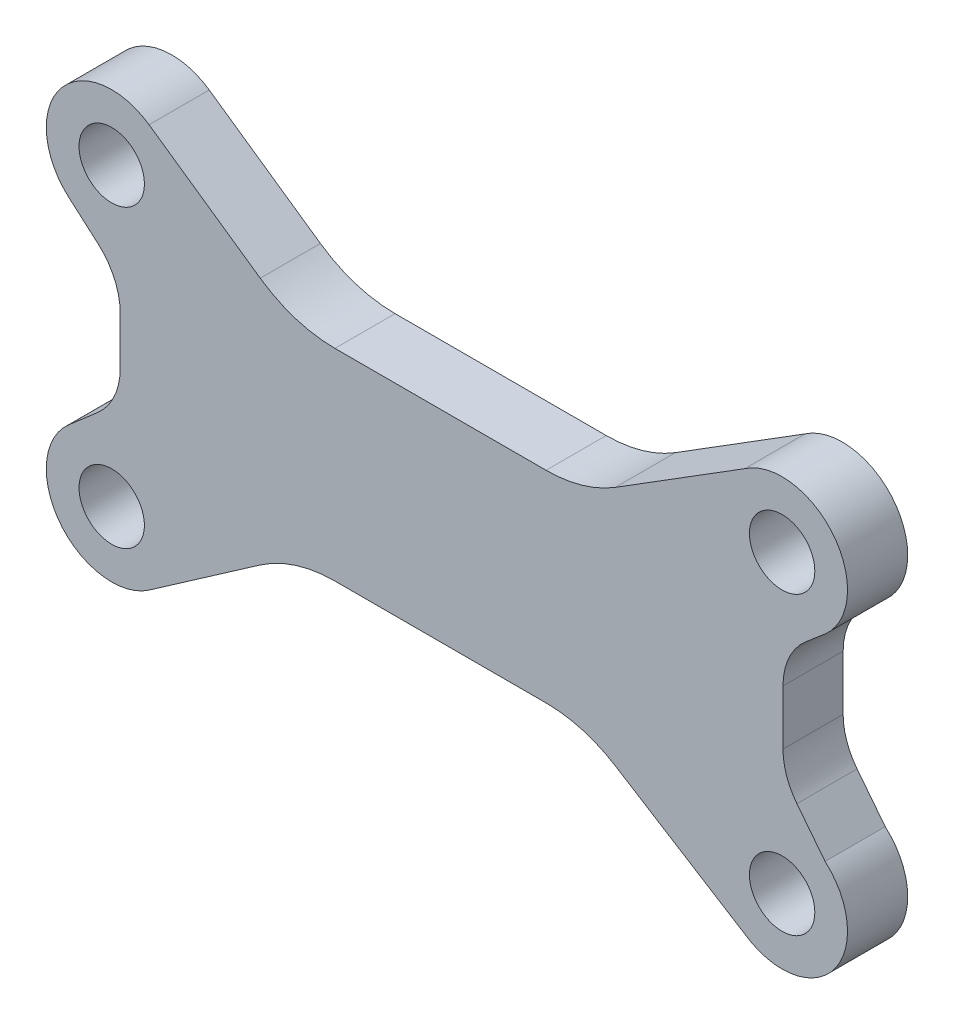
ISO-10303-21;
HEADER;
FILE_DESCRIPTION(('STEP AP214'),'2;1');
FILE_NAME('part.step','',(''),(''),'','','');
FILE_SCHEMA(('AUTOMOTIVE_DESIGN { 1 0 10303 214 1 1 1 1 }'));
ENDSEC;
DATA;
#1=APPLICATION_CONTEXT('core data for automotive mechanical design processes');
#2=APPLICATION_PROTOCOL_DEFINITION('international standard','automotive_design',2000,#1);
#3=PRODUCT_CONTEXT('',#1,'mechanical');
#4=PRODUCT('Part','Part','',(#3));
#5=PRODUCT_RELATED_PRODUCT_CATEGORY('part','',(#4));
#6=PRODUCT_DEFINITION_FORMATION('','',#4);
#7=PRODUCT_DEFINITION_CONTEXT('part definition',#1,'design');
#8=PRODUCT_DEFINITION('design','',#6,#7);
#9=PRODUCT_DEFINITION_SHAPE('','',#8);
#10=(LENGTH_UNIT() NAMED_UNIT(*) SI_UNIT(.MILLI.,.METRE.));
#11=(NAMED_UNIT(*) PLANE_ANGLE_UNIT() SI_UNIT($,.RADIAN.));
#12=(NAMED_UNIT(*) SI_UNIT($,.STERADIAN.) SOLID_ANGLE_UNIT());
#13=UNCERTAINTY_MEASURE_WITH_UNIT(LENGTH_MEASURE(1.E-05),#10,'distance_accuracy_value','');
#14=(GEOMETRIC_REPRESENTATION_CONTEXT(3) GLOBAL_UNCERTAINTY_ASSIGNED_CONTEXT((#13)) GLOBAL_UNIT_ASSIGNED_CONTEXT((#10,
#11,#12)) REPRESENTATION_CONTEXT('',''));
#15=CARTESIAN_POINT('',(0.,0.,0.));
#16=DIRECTION('',(0.,0.,1.));
#17=DIRECTION('',(1.,0.,0.));
#18=AXIS2_PLACEMENT_3D('',#15,#16,#17);
#19=CARTESIAN_POINT('',(7.9988438587581,12.7968153605601,5.842));
#20=DIRECTION('',(0.530038692512877,0.847973457390761,0.));
#21=DIRECTION('',(-0.847973457390761,0.530038692512877,0.));
#22=AXIS2_PLACEMENT_3D('',#19,#20,#21);
#23=PLANE('',#22);
#24=DIRECTION('',(0.847973457390761,-0.530038692512877,0.));
#25=VECTOR('',#24,1.);
#26=CARTESIAN_POINT('',(7.9988438587581,12.7968153605601,5.842));
#27=LINE('',#26,#25);
#28=CARTESIAN_POINT('',(30.0775501632188,-1.00381544927842,5.842));
#29=VERTEX_POINT('',#28);
#30=CARTESIAN_POINT('',(42.6381003070978,-8.85497814485335,5.842));
#31=VERTEX_POINT('',#30);
#32=EDGE_CURVE('E194',#29,#31,#27,.T.);
#33=ORIENTED_EDGE('',*,*,#32,.F.);
#34=DIRECTION('',(0.,0.,-1.));
#35=VECTOR('',#34,1.);
#36=CARTESIAN_POINT('',(30.0775501632188,-1.00381544927842,0.));
#37=LINE('',#36,#35);
#38=CARTESIAN_POINT('',(30.0775501632188,-1.00381544927842,0.));
#39=VERTEX_POINT('',#38);
#40=EDGE_CURVE('E262',#29,#39,#37,.T.);
#41=ORIENTED_EDGE('',*,*,#40,.T.);
#42=DIRECTION('',(0.847973457390761,-0.530038692512877,0.));
#43=VECTOR('',#42,1.);
#44=CARTESIAN_POINT('',(7.9988438587581,12.7968153605601,0.));
#45=LINE('',#44,#43);
#46=CARTESIAN_POINT('',(42.6381003070978,-8.85497814485335,0.));
#47=VERTEX_POINT('',#46);
#48=EDGE_CURVE('E219',#39,#47,#45,.T.);
#49=ORIENTED_EDGE('',*,*,#48,.T.);
#50=DIRECTION('',(0.,0.,-1.));
#51=VECTOR('',#50,1.);
#52=CARTESIAN_POINT('',(42.6381003070978,-8.85497814485335,5.842));
#53=LINE('',#52,#51);
#54=EDGE_CURVE('E213',#31,#47,#53,.T.);
#55=ORIENTED_EDGE('',*,*,#54,.F.);
#56=EDGE_LOOP('',(#33,#41,#49,#55));
#57=FACE_BOUND('',#56,.T.);
#58=ADVANCED_FACE('F35',(#57),#23,.F.);
#59=CARTESIAN_POINT('',(46.2642857142858,-3.64217857142864,5.842));
#60=DIRECTION('',(0.,0.,-1.));
#61=DIRECTION('',(-1.,0.,0.));
#62=AXIS2_PLACEMENT_3D('',#59,#60,#61);
#63=CYLINDRICAL_SURFACE('',#62,6.34999999999998);
#64=CARTESIAN_POINT('',(46.2642857142858,-3.64217857142864,0.));
#65=DIRECTION('',(0.,0.,1.));
#66=DIRECTION('',(1.,0.,0.));
#67=AXIS2_PLACEMENT_3D('',#64,#65,#66);
#68=CIRCLE('',#67,6.34999999999998);
#69=CARTESIAN_POINT('',(50.4355568317075,1.14561813112288,0.));
#70=VERTEX_POINT('',#69);
#71=EDGE_CURVE('E348',#47,#70,#68,.T.);
#72=ORIENTED_EDGE('',*,*,#71,.T.);
#73=DIRECTION('',(0.,0.,-1.));
#74=VECTOR('',#73,1.);
#75=CARTESIAN_POINT('',(50.4355568317075,1.14561813112288,5.842));
#76=LINE('',#75,#74);
#77=CARTESIAN_POINT('',(50.4355568317075,1.14561813112288,5.842));
#78=VERTEX_POINT('',#77);
#79=EDGE_CURVE('E215',#78,#70,#76,.T.);
#80=ORIENTED_EDGE('',*,*,#79,.F.);
#81=CARTESIAN_POINT('',(46.2642857142858,-3.64217857142864,5.842));
#82=DIRECTION('',(0.,0.,1.));
#83=DIRECTION('',(1.,0.,0.));
#84=AXIS2_PLACEMENT_3D('',#81,#82,#83);
#85=CIRCLE('',#84,6.34999999999998);
#86=EDGE_CURVE('E199',#31,#78,#85,.T.);
#87=ORIENTED_EDGE('',*,*,#86,.F.);
#88=ORIENTED_EDGE('',*,*,#54,.T.);
#89=EDGE_LOOP('',(#72,#80,#87,#88));
#90=FACE_BOUND('',#89,.T.);
#91=ADVANCED_FACE('F212',(#90),#63,.T.);
#92=CARTESIAN_POINT('',(31.8134522209213,24.9195038209863,5.842));
#93=DIRECTION('',(0.787240471629052,0.616646122041863,0.));
#94=DIRECTION('',(-0.616646122041863,0.787240471629052,0.));
#95=AXIS2_PLACEMENT_3D('',#92,#93,#94);
#96=PLANE('',#95);
#97=DIRECTION('',(0.616646122041863,-0.787240471629052,0.));
#98=VECTOR('',#97,1.);
#99=CARTESIAN_POINT('',(31.8134522209213,24.9195038209863,0.));
#100=LINE('',#99,#98);
#101=CARTESIAN_POINT('',(47.6995913394399,4.63848492701161,0.));
#102=VERTEX_POINT('',#101);
#103=EDGE_CURVE('E350',#102,#70,#100,.T.);
#104=ORIENTED_EDGE('',*,*,#103,.F.);
#105=DIRECTION('',(0.,0.,-1.));
#106=VECTOR('',#105,1.);
#107=CARTESIAN_POINT('',(47.6995913394399,4.63848492701161,5.842));
#108=LINE('',#107,#106);
#109=CARTESIAN_POINT('',(47.6995913394399,4.63848492701161,5.842));
#110=VERTEX_POINT('',#109);
#111=EDGE_CURVE('E244',#102,#110,#108,.F.);
#112=ORIENTED_EDGE('',*,*,#111,.T.);
#113=DIRECTION('',(0.616646122041863,-0.787240471629052,0.));
#114=VECTOR('',#113,1.);
#115=CARTESIAN_POINT('',(31.8134522209213,24.9195038209863,5.842));
#116=LINE('',#115,#114);
#117=EDGE_CURVE('E216',#110,#78,#116,.T.);
#118=ORIENTED_EDGE('',*,*,#117,.T.);
#119=ORIENTED_EDGE('',*,*,#79,.T.);
#120=EDGE_LOOP('',(#104,#112,#118,#119));
#121=FACE_BOUND('',#120,.T.);
#122=ADVANCED_FACE('F467',(#121),#96,.T.);
#123=CARTESIAN_POINT('',(46.3485683342843,0.,5.842));
#124=DIRECTION('',(1.,0.,0.));
#125=DIRECTION('',(0.,0.,-1.));
#126=AXIS2_PLACEMENT_3D('',#123,#124,#125);
#127=PLANE('',#126);
#128=DIRECTION('',(0.,-1.,0.));
#129=VECTOR('',#128,1.);
#130=CARTESIAN_POINT('',(46.3485683342843,0.,0.));
#131=LINE('',#130,#129);
#132=CARTESIAN_POINT('',(46.3485683342843,13.8618043816147,0.));
#133=VERTEX_POINT('',#132);
#134=CARTESIAN_POINT('',(46.3485683342843,8.55418780197744,0.));
#135=VERTEX_POINT('',#134);
#136=EDGE_CURVE('E352',#133,#135,#131,.T.);
#137=ORIENTED_EDGE('',*,*,#136,.F.);
#138=DIRECTION('',(0.,0.,-1.));
#139=VECTOR('',#138,1.);
#140=CARTESIAN_POINT('',(46.3485683342843,13.8618043816147,5.842));
#141=LINE('',#140,#139);
#142=CARTESIAN_POINT('',(46.3485683342843,13.8618043816147,5.842));
#143=VERTEX_POINT('',#142);
#144=EDGE_CURVE('E242',#133,#143,#141,.F.);
#145=ORIENTED_EDGE('',*,*,#144,.T.);
#146=DIRECTION('',(0.,-1.,0.));
#147=VECTOR('',#146,1.);
#148=CARTESIAN_POINT('',(46.3485683342843,0.,5.842));
#149=LINE('',#148,#147);
#150=CARTESIAN_POINT('',(46.3485683342843,8.55418780197744,5.842));
#151=VERTEX_POINT('',#150);
#152=EDGE_CURVE('E412',#143,#151,#149,.T.);
#153=ORIENTED_EDGE('',*,*,#152,.T.);
#154=DIRECTION('',(0.,0.,-1.));
#155=VECTOR('',#154,1.);
#156=CARTESIAN_POINT('',(46.3485683342843,8.55418780197744,0.));
#157=LINE('',#156,#155);
#158=EDGE_CURVE('E239',#151,#135,#157,.T.);
#159=ORIENTED_EDGE('',*,*,#158,.T.);
#160=EDGE_LOOP('',(#137,#145,#153,#159));
#161=FACE_BOUND('',#160,.T.);
#162=ADVANCED_FACE('F653',(#161),#127,.T.);
#163=CARTESIAN_POINT('',(11.1483390324467,-13.1175028613776,5.842));
#164=DIRECTION('',(-0.647596538075008,0.761983414434503,0.));
#165=DIRECTION('',(-0.761983414434503,-0.647596538075008,0.));
#166=AXIS2_PLACEMENT_3D('',#163,#164,#165);
#167=PLANE('',#166);
#168=DIRECTION('',(0.761983414434503,0.647596538075009,0.));
#169=VECTOR('',#168,1.);
#170=CARTESIAN_POINT('',(11.1483390324467,-13.1175028613776,5.842));
#171=LINE('',#170,#169);
#172=CARTESIAN_POINT('',(48.586330317508,18.7003990632738,5.842));
#173=VERTEX_POINT('',#172);
#174=CARTESIAN_POINT('',(50.4355568317075,20.2720247260198,5.842));
#175=VERTEX_POINT('',#174);
#176=EDGE_CURVE('E410',#173,#175,#171,.T.);
#177=ORIENTED_EDGE('',*,*,#176,.F.);
#178=DIRECTION('',(0.,0.,-1.));
#179=VECTOR('',#178,1.);
#180=CARTESIAN_POINT('',(48.586330317508,18.7003990632738,5.842));
#181=LINE('',#180,#179);
#182=CARTESIAN_POINT('',(48.586330317508,18.7003990632738,0.));
#183=VERTEX_POINT('',#182);
#184=EDGE_CURVE('E236',#173,#183,#181,.T.);
#185=ORIENTED_EDGE('',*,*,#184,.T.);
#186=DIRECTION('',(0.761983414434503,0.647596538075009,0.));
#187=VECTOR('',#186,1.);
#188=CARTESIAN_POINT('',(11.1483390324467,-13.1175028613776,0.));
#189=LINE('',#188,#187);
#190=CARTESIAN_POINT('',(50.4355568317075,20.2720247260198,0.));
#191=VERTEX_POINT('',#190);
#192=EDGE_CURVE('E355',#183,#191,#189,.T.);
#193=ORIENTED_EDGE('',*,*,#192,.T.);
#194=DIRECTION('',(0.,0.,-1.));
#195=VECTOR('',#194,1.);
#196=CARTESIAN_POINT('',(50.4355568317075,20.2720247260198,5.842));
#197=LINE('',#196,#195);
#198=EDGE_CURVE('E225',#175,#191,#197,.T.);
#199=ORIENTED_EDGE('',*,*,#198,.F.);
#200=EDGE_LOOP('',(#177,#185,#193,#199));
#201=FACE_BOUND('',#200,.T.);
#202=ADVANCED_FACE('F648',(#201),#167,.F.);
#203=CARTESIAN_POINT('',(46.2642857142858,25.0598214285714,5.842));
#204=DIRECTION('',(0.,0.,-1.));
#205=DIRECTION('',(-1.,0.,0.));
#206=AXIS2_PLACEMENT_3D('',#203,#204,#205);
#207=CYLINDRICAL_SURFACE('',#206,6.34999999999998);
#208=CARTESIAN_POINT('',(46.2642857142858,25.0598214285714,0.));
#209=DIRECTION('',(0.,0.,1.));
#210=DIRECTION('',(1.,0.,0.));
#211=AXIS2_PLACEMENT_3D('',#208,#209,#210);
#212=CIRCLE('',#211,6.34999999999998);
#213=CARTESIAN_POINT('',(42.6381003070978,30.2726210019961,0.));
#214=VERTEX_POINT('',#213);
#215=EDGE_CURVE('E357',#191,#214,#212,.T.);
#216=ORIENTED_EDGE('',*,*,#215,.T.);
#217=DIRECTION('',(0.,0.,-1.));
#218=VECTOR('',#217,1.);
#219=CARTESIAN_POINT('',(42.6381003070978,30.2726210019961,5.842));
#220=LINE('',#219,#218);
#221=CARTESIAN_POINT('',(42.6381003070978,30.2726210019961,5.842));
#222=VERTEX_POINT('',#221);
#223=EDGE_CURVE('E390',#222,#214,#220,.T.);
#224=ORIENTED_EDGE('',*,*,#223,.F.);
#225=CARTESIAN_POINT('',(46.2642857142858,25.0598214285714,5.842));
#226=DIRECTION('',(0.,0.,1.));
#227=DIRECTION('',(1.,0.,0.));
#228=AXIS2_PLACEMENT_3D('',#225,#226,#227);
#229=CIRCLE('',#228,6.34999999999998);
#230=EDGE_CURVE('E400',#175,#222,#229,.T.);
#231=ORIENTED_EDGE('',*,*,#230,.F.);
#232=ORIENTED_EDGE('',*,*,#198,.T.);
#233=EDGE_LOOP('',(#216,#224,#231,#232));
#234=FACE_BOUND('',#233,.T.);
#235=ADVANCED_FACE('F397',(#234),#207,.T.);
#236=CARTESIAN_POINT('',(-1.62750297014774,2.60373316137931,5.842));
#237=DIRECTION('',(-0.530038692512877,0.847973457390761,0.));
#238=DIRECTION('',(-0.847973457390761,-0.530038692512877,0.));
#239=AXIS2_PLACEMENT_3D('',#236,#237,#238);
#240=PLANE('',#239);
#241=DIRECTION('',(0.847973457390761,0.530038692512877,0.));
#242=VECTOR('',#241,1.);
#243=CARTESIAN_POINT('',(-1.62750297014774,2.60373316137931,0.));
#244=LINE('',#243,#242);
#245=CARTESIAN_POINT('',(30.0775501632187,22.4214583064211,0.));
#246=VERTEX_POINT('',#245);
#247=EDGE_CURVE('E302',#246,#214,#244,.T.);
#248=ORIENTED_EDGE('',*,*,#247,.F.);
#249=DIRECTION('',(0.,0.,-1.));
#250=VECTOR('',#249,1.);
#251=CARTESIAN_POINT('',(30.0775501632187,22.4214583064211,5.842));
#252=LINE('',#251,#250);
#253=CARTESIAN_POINT('',(30.0775501632187,22.4214583064211,5.842));
#254=VERTEX_POINT('',#253);
#255=EDGE_CURVE('E276',#246,#254,#252,.F.);
#256=ORIENTED_EDGE('',*,*,#255,.T.);
#257=DIRECTION('',(0.847973457390761,0.530038692512877,0.));
#258=VECTOR('',#257,1.);
#259=CARTESIAN_POINT('',(-1.62750297014774,2.60373316137931,5.842));
#260=LINE('',#259,#258);
#261=EDGE_CURVE('E317',#254,#222,#260,.T.);
#262=ORIENTED_EDGE('',*,*,#261,.T.);
#263=ORIENTED_EDGE('',*,*,#223,.T.);
#264=EDGE_LOOP('',(#248,#256,#262,#263));
#265=FACE_BOUND('',#264,.T.);
#266=ADVANCED_FACE('F407',(#265),#240,.T.);
#267=CARTESIAN_POINT('',(0.,20.4907212152837,5.842));
#268=DIRECTION('',(0.,1.,0.));
#269=DIRECTION('',(-1.,0.,0.));
#270=AXIS2_PLACEMENT_3D('',#267,#268,#269);
#271=PLANE('',#270);
#272=DIRECTION('',(1.,0.,0.));
#273=VECTOR('',#272,1.);
#274=CARTESIAN_POINT('',(0.,20.4907212152837,5.842));
#275=LINE('',#274,#273);
#276=CARTESIAN_POINT('',(2.84769887402014,20.4907212152837,5.842));
#277=VERTEX_POINT('',#276);
#278=CARTESIAN_POINT('',(23.3460587683052,20.4907212152837,5.842));
#279=VERTEX_POINT('',#278);
#280=EDGE_CURVE('E313',#277,#279,#275,.T.);
#281=ORIENTED_EDGE('',*,*,#280,.T.);
#282=DIRECTION('',(0.,0.,-1.));
#283=VECTOR('',#282,1.);
#284=CARTESIAN_POINT('',(23.3460587683052,20.4907212152837,0.));
#285=LINE('',#284,#283);
#286=CARTESIAN_POINT('',(23.3460587683052,20.4907212152837,0.));
#287=VERTEX_POINT('',#286);
#288=EDGE_CURVE('E273',#279,#287,#285,.T.);
#289=ORIENTED_EDGE('',*,*,#288,.T.);
#290=DIRECTION('',(1.,0.,0.));
#291=VECTOR('',#290,1.);
#292=CARTESIAN_POINT('',(0.,20.4907212152837,0.));
#293=LINE('',#292,#291);
#294=CARTESIAN_POINT('',(2.84769887402014,20.4907212152837,0.));
#295=VERTEX_POINT('',#294);
#296=EDGE_CURVE('E295',#295,#287,#293,.T.);
#297=ORIENTED_EDGE('',*,*,#296,.F.);
#298=DIRECTION('',(0.,0.,-1.));
#299=VECTOR('',#298,1.);
#300=CARTESIAN_POINT('',(2.84769887402014,20.4907212152837,5.842));
#301=LINE('',#300,#299);
#302=EDGE_CURVE('E271',#295,#277,#301,.F.);
#303=ORIENTED_EDGE('',*,*,#302,.T.);
#304=EDGE_LOOP('',(#281,#289,#297,#303));
#305=FACE_BOUND('',#304,.T.);
#306=ADVANCED_FACE('F300',(#305),#271,.T.);
#307=CARTESIAN_POINT('',(9.23557534126024,13.2765420940203,5.842));
#308=DIRECTION('',(-0.571052820029602,-0.820913318649563,0.));
#309=DIRECTION('',(0.820913318649563,-0.571052820029602,0.));
#310=AXIS2_PLACEMENT_3D('',#307,#308,#309);
#311=PLANE('',#310);
#312=DIRECTION('',(-0.820913318649563,0.571052820029602,0.));
#313=VECTOR('',#312,1.);
#314=CARTESIAN_POINT('',(9.23557534126024,13.2765420940203,5.842));
#315=LINE('',#314,#313);
#316=CARTESIAN_POINT('',(-4.40467194035581,22.7651220684343,5.842));
#317=VERTEX_POINT('',#316);
#318=CARTESIAN_POINT('',(-15.1970288785263,30.2726210019961,5.842));
#319=VERTEX_POINT('',#318);
#320=EDGE_CURVE('E308',#317,#319,#315,.T.);
#321=ORIENTED_EDGE('',*,*,#320,.F.);
#322=DIRECTION('',(0.,0.,-1.));
#323=VECTOR('',#322,1.);
#324=CARTESIAN_POINT('',(-4.4046719403558,22.7651220684343,5.842));
#325=LINE('',#324,#323);
#326=CARTESIAN_POINT('',(-4.40467194035581,22.7651220684343,0.));
#327=VERTEX_POINT('',#326);
#328=EDGE_CURVE('E278',#317,#327,#325,.T.);
#329=ORIENTED_EDGE('',*,*,#328,.T.);
#330=DIRECTION('',(-0.820913318649563,0.571052820029602,0.));
#331=VECTOR('',#330,1.);
#332=CARTESIAN_POINT('',(9.23557534126024,13.2765420940203,0.));
#333=LINE('',#332,#331);
#334=CARTESIAN_POINT('',(-15.1970288785263,30.2726210019961,0.));
#335=VERTEX_POINT('',#334);
#336=EDGE_CURVE('E297',#327,#335,#333,.T.);
#337=ORIENTED_EDGE('',*,*,#336,.T.);
#338=DIRECTION('',(0.,0.,-1.));
#339=VECTOR('',#338,1.);
#340=CARTESIAN_POINT('',(-15.1970288785263,30.2726210019961,5.842));
#341=LINE('',#340,#339);
#342=EDGE_CURVE('E309',#319,#335,#341,.T.);
#343=ORIENTED_EDGE('',*,*,#342,.F.);
#344=EDGE_LOOP('',(#321,#329,#337,#343));
#345=FACE_BOUND('',#344,.T.);
#346=ADVANCED_FACE('F305',(#345),#311,.F.);
#347=CARTESIAN_POINT('',(-18.8232142857142,25.0598214285713,5.842));
#348=DIRECTION('',(0.,0.,-1.));
#349=DIRECTION('',(-1.,0.,0.));
#350=AXIS2_PLACEMENT_3D('',#347,#348,#349);
#351=CYLINDRICAL_SURFACE('',#350,6.35);
#352=CARTESIAN_POINT('',(-18.8232142857142,25.0598214285713,0.));
#353=DIRECTION('',(0.,0.,1.));
#354=DIRECTION('',(1.,0.,0.));
#355=AXIS2_PLACEMENT_3D('',#352,#353,#354);
#356=CIRCLE('',#355,6.35);
#357=CARTESIAN_POINT('',(-22.9944854031359,20.2720247260198,0.));
#358=VERTEX_POINT('',#357);
#359=EDGE_CURVE('E362',#335,#358,#356,.T.);
#360=ORIENTED_EDGE('',*,*,#359,.T.);
#361=DIRECTION('',(0.,0.,-1.));
#362=VECTOR('',#361,1.);
#363=CARTESIAN_POINT('',(-22.9944854031359,20.2720247260198,5.842));
#364=LINE('',#363,#362);
#365=CARTESIAN_POINT('',(-22.9944854031359,20.2720247260198,5.842));
#366=VERTEX_POINT('',#365);
#367=EDGE_CURVE('E386',#366,#358,#364,.T.);
#368=ORIENTED_EDGE('',*,*,#367,.F.);
#369=CARTESIAN_POINT('',(-18.8232142857142,25.0598214285713,5.842));
#370=DIRECTION('',(0.,0.,1.));
#371=DIRECTION('',(1.,0.,0.));
#372=AXIS2_PLACEMENT_3D('',#369,#370,#371);
#373=CIRCLE('',#372,6.35);
#374=EDGE_CURVE('E312',#319,#366,#373,.T.);
#375=ORIENTED_EDGE('',*,*,#374,.F.);
#376=ORIENTED_EDGE('',*,*,#342,.T.);
#377=EDGE_LOOP('',(#360,#368,#375,#376));
#378=FACE_BOUND('',#377,.T.);
#379=ADVANCED_FACE('F565',(#378),#351,.T.);
#380=CARTESIAN_POINT('',(0.118147685734078,0.135610245473893,5.842));
#381=DIRECTION('',(-0.65689308935775,-0.753983732685282,0.));
#382=DIRECTION('',(0.753983732685282,-0.65689308935775,0.));
#383=AXIS2_PLACEMENT_3D('',#380,#381,#382);
#384=PLANE('',#383);
#385=DIRECTION('',(-0.753983732685282,0.65689308935775,0.));
#386=VECTOR('',#385,1.);
#387=CARTESIAN_POINT('',(0.118147685734078,0.135610245473893,0.));
#388=LINE('',#387,#386);
#389=CARTESIAN_POINT('',(-20.1759837306518,17.816462104789,0.));
#390=VERTEX_POINT('',#389);
#391=EDGE_CURVE('E365',#390,#358,#388,.T.);
#392=ORIENTED_EDGE('',*,*,#391,.F.);
#393=DIRECTION('',(0.,0.,-1.));
#394=VECTOR('',#393,1.);
#395=CARTESIAN_POINT('',(-20.1759837306518,17.816462104789,5.842));
#396=LINE('',#395,#394);
#397=CARTESIAN_POINT('',(-20.1759837306518,17.816462104789,5.842));
#398=VERTEX_POINT('',#397);
#399=EDGE_CURVE('E231',#390,#398,#396,.F.);
#400=ORIENTED_EDGE('',*,*,#399,.T.);
#401=DIRECTION('',(-0.753983732685282,0.65689308935775,0.));
#402=VECTOR('',#401,1.);
#403=CARTESIAN_POINT('',(0.118147685734078,0.135610245473893,5.842));
#404=LINE('',#403,#402);
#405=EDGE_CURVE('E315',#398,#366,#404,.T.);
#406=ORIENTED_EDGE('',*,*,#405,.T.);
#407=ORIENTED_EDGE('',*,*,#367,.T.);
#408=EDGE_LOOP('',(#392,#400,#406,#407));
#409=FACE_BOUND('',#408,.T.);
#410=ADVANCED_FACE('F633',(#409),#384,.T.);
#411=CARTESIAN_POINT('',(-17.9972548480735,0.,5.842));
#412=DIRECTION('',(1.,0.,0.));
#413=DIRECTION('',(0.,1.,0.));
#414=AXIS2_PLACEMENT_3D('',#411,#412,#413);
#415=PLANE('',#414);
#416=DIRECTION('',(0.,-1.,0.));
#417=VECTOR('',#416,1.);
#418=CARTESIAN_POINT('',(-17.9972548480735,0.,5.842));
#419=LINE('',#418,#417);
#420=CARTESIAN_POINT('',(-17.9972548480735,13.0286654022374,5.842));
#421=VERTEX_POINT('',#420);
#422=CARTESIAN_POINT('',(-17.9972548480735,8.37976324890263,5.842));
#423=VERTEX_POINT('',#422);
#424=EDGE_CURVE('E322',#421,#423,#419,.T.);
#425=ORIENTED_EDGE('',*,*,#424,.F.);
#426=DIRECTION('',(0.,0.,-1.));
#427=VECTOR('',#426,1.);
#428=CARTESIAN_POINT('',(-17.9972548480735,13.0286654022374,5.842));
#429=LINE('',#428,#427);
#430=CARTESIAN_POINT('',(-17.9972548480735,13.0286654022374,0.));
#431=VERTEX_POINT('',#430);
#432=EDGE_CURVE('E223',#421,#431,#429,.T.);
#433=ORIENTED_EDGE('',*,*,#432,.T.);
#434=DIRECTION('',(0.,-1.,0.));
#435=VECTOR('',#434,1.);
#436=CARTESIAN_POINT('',(-17.9972548480735,0.,0.));
#437=LINE('',#436,#435);
#438=CARTESIAN_POINT('',(-17.9972548480735,8.37976324890263,0.));
#439=VERTEX_POINT('',#438);
#440=EDGE_CURVE('E367',#431,#439,#437,.T.);
#441=ORIENTED_EDGE('',*,*,#440,.T.);
#442=DIRECTION('',(0.,0.,-1.));
#443=VECTOR('',#442,1.);
#444=CARTESIAN_POINT('',(-17.9972548480735,8.37976324890263,5.842));
#445=LINE('',#444,#443);
#446=EDGE_CURVE('E221',#439,#423,#445,.F.);
#447=ORIENTED_EDGE('',*,*,#446,.T.);
#448=EDGE_LOOP('',(#425,#433,#441,#447));
#449=FACE_BOUND('',#448,.T.);
#450=ADVANCED_FACE('F622',(#449),#415,.F.);
#451=CARTESIAN_POINT('',(-10.4469720837385,12.0363003135919,5.842));
#452=DIRECTION('',(0.65548616560243,-0.755207181311078,0.));
#453=DIRECTION('',(0.755207181311078,0.65548616560243,0.));
#454=AXIS2_PLACEMENT_3D('',#451,#452,#453);
#455=PLANE('',#454);
#456=DIRECTION('',(-0.755207181311078,-0.65548616560243,0.));
#457=VECTOR('',#456,1.);
#458=CARTESIAN_POINT('',(-10.4469720837385,12.0363003135919,5.842));
#459=LINE('',#458,#457);
#460=CARTESIAN_POINT('',(-20.1849176964981,3.58419764757728,5.842));
#461=VERTEX_POINT('',#460);
#462=CARTESIAN_POINT('',(-22.9944854031359,1.14561813112287,5.842));
#463=VERTEX_POINT('',#462);
#464=EDGE_CURVE('E325',#461,#463,#459,.T.);
#465=ORIENTED_EDGE('',*,*,#464,.F.);
#466=DIRECTION('',(0.,0.,-1.));
#467=VECTOR('',#466,1.);
#468=CARTESIAN_POINT('',(-20.1849176964981,3.58419764757729,0.));
#469=LINE('',#468,#467);
#470=CARTESIAN_POINT('',(-20.1849176964981,3.58419764757728,0.));
#471=VERTEX_POINT('',#470);
#472=EDGE_CURVE('E233',#461,#471,#469,.T.);
#473=ORIENTED_EDGE('',*,*,#472,.T.);
#474=DIRECTION('',(-0.755207181311078,-0.65548616560243,0.));
#475=VECTOR('',#474,1.);
#476=CARTESIAN_POINT('',(-10.4469720837385,12.0363003135919,0.));
#477=LINE('',#476,#475);
#478=CARTESIAN_POINT('',(-22.9944854031359,1.14561813112287,0.));
#479=VERTEX_POINT('',#478);
#480=EDGE_CURVE('E370',#471,#479,#477,.T.);
#481=ORIENTED_EDGE('',*,*,#480,.T.);
#482=DIRECTION('',(0.,0.,-1.));
#483=VECTOR('',#482,1.);
#484=CARTESIAN_POINT('',(-22.9944854031359,1.14561813112287,5.842));
#485=LINE('',#484,#483);
#486=EDGE_CURVE('E383',#463,#479,#485,.T.);
#487=ORIENTED_EDGE('',*,*,#486,.F.);
#488=EDGE_LOOP('',(#465,#473,#481,#487));
#489=FACE_BOUND('',#488,.T.);
#490=ADVANCED_FACE('F617',(#489),#455,.F.);
#491=CARTESIAN_POINT('',(-18.8232142857139,-3.64217857142865,5.842));
#492=DIRECTION('',(0.,0.,-1.));
#493=DIRECTION('',(-1.,0.,0.));
#494=AXIS2_PLACEMENT_3D('',#491,#492,#493);
#495=CYLINDRICAL_SURFACE('',#494,6.35000000000009);
#496=CARTESIAN_POINT('',(-18.8232142857139,-3.64217857142865,0.));
#497=DIRECTION('',(0.,0.,1.));
#498=DIRECTION('',(1.,0.,0.));
#499=AXIS2_PLACEMENT_3D('',#496,#497,#498);
#500=CIRCLE('',#499,6.35000000000009);
#501=CARTESIAN_POINT('',(-15.1970288785263,-8.85497814485337,0.));
#502=VERTEX_POINT('',#501);
#503=EDGE_CURVE('E372',#479,#502,#500,.T.);
#504=ORIENTED_EDGE('',*,*,#503,.T.);
#505=DIRECTION('',(0.,0.,-1.));
#506=VECTOR('',#505,1.);
#507=CARTESIAN_POINT('',(-15.1970288785263,-8.85497814485337,5.842));
#508=LINE('',#507,#506);
#509=CARTESIAN_POINT('',(-15.1970288785263,-8.85497814485337,5.842));
#510=VERTEX_POINT('',#509);
#511=EDGE_CURVE('E334',#510,#502,#508,.T.);
#512=ORIENTED_EDGE('',*,*,#511,.F.);
#513=CARTESIAN_POINT('',(-18.8232142857139,-3.64217857142865,5.842));
#514=DIRECTION('',(0.,0.,1.));
#515=DIRECTION('',(1.,0.,0.));
#516=AXIS2_PLACEMENT_3D('',#513,#514,#515);
#517=CIRCLE('',#516,6.35000000000009);
#518=EDGE_CURVE('E327',#463,#510,#517,.T.);
#519=ORIENTED_EDGE('',*,*,#518,.F.);
#520=ORIENTED_EDGE('',*,*,#486,.T.);
#521=EDGE_LOOP('',(#504,#512,#519,#520));
#522=FACE_BOUND('',#521,.T.);
#523=ADVANCED_FACE('F552',(#522),#495,.T.);
#524=CARTESIAN_POINT('',(-0.804691487308451,1.156779086217,5.842));
#525=DIRECTION('',(0.571052820029571,-0.820913318649585,0.));
#526=DIRECTION('',(0.820913318649585,0.571052820029571,0.));
#527=AXIS2_PLACEMENT_3D('',#524,#525,#526);
#528=PLANE('',#527);
#529=DIRECTION('',(-0.820913318649585,-0.571052820029571,0.));
#530=VECTOR('',#529,1.);
#531=CARTESIAN_POINT('',(-0.804691487308451,1.156779086217,0.));
#532=LINE('',#531,#530);
#533=CARTESIAN_POINT('',(-4.40467194035518,-1.34747921129175,0.));
#534=VERTEX_POINT('',#533);
#535=EDGE_CURVE('E375',#534,#502,#532,.T.);
#536=ORIENTED_EDGE('',*,*,#535,.F.);
#537=DIRECTION('',(0.,0.,-1.));
#538=VECTOR('',#537,1.);
#539=CARTESIAN_POINT('',(-4.40467194035518,-1.34747921129175,5.842));
#540=LINE('',#539,#538);
#541=CARTESIAN_POINT('',(-4.40467194035518,-1.34747921129175,5.842));
#542=VERTEX_POINT('',#541);
#543=EDGE_CURVE('E269',#534,#542,#540,.F.);
#544=ORIENTED_EDGE('',*,*,#543,.T.);
#545=DIRECTION('',(-0.820913318649585,-0.571052820029571,0.));
#546=VECTOR('',#545,1.);
#547=CARTESIAN_POINT('',(-0.804691487308451,1.156779086217,5.842));
#548=LINE('',#547,#546);
#549=EDGE_CURVE('E330',#542,#510,#548,.T.);
#550=ORIENTED_EDGE('',*,*,#549,.T.);
#551=ORIENTED_EDGE('',*,*,#511,.T.);
#552=EDGE_LOOP('',(#536,#544,#550,#551));
#553=FACE_BOUND('',#552,.T.);
#554=ADVANCED_FACE('F446',(#553),#528,.T.);
#555=CARTESIAN_POINT('',(-18.8232142857139,-3.64217857142865,5.842));
#556=DIRECTION('',(0.,0.,-1.));
#557=DIRECTION('',(-1.,0.,0.));
#558=AXIS2_PLACEMENT_3D('',#555,#556,#557);
#559=CYLINDRICAL_SURFACE('',#558,3.175);
#560=CARTESIAN_POINT('',(-18.8232142857139,-3.64217857142865,5.842));
#561=DIRECTION('',(0.,0.,1.));
#562=DIRECTION('',(1.,0.,0.));
#563=AXIS2_PLACEMENT_3D('',#560,#561,#562);
#564=CIRCLE('',#563,3.175);
#565=CARTESIAN_POINT('',(-15.6482142857139,-3.64217857142865,5.842));
#566=VERTEX_POINT('',#565);
#567=EDGE_CURVE('E207',#566,#566,#564,.T.);
#568=ORIENTED_EDGE('',*,*,#567,.T.);
#569=EDGE_LOOP('',(#568));
#570=FACE_BOUND('',#569,.T.);
#571=CARTESIAN_POINT('',(-18.8232142857139,-3.64217857142865,0.));
#572=DIRECTION('',(0.,0.,1.));
#573=DIRECTION('',(1.,0.,0.));
#574=AXIS2_PLACEMENT_3D('',#571,#572,#573);
#575=CIRCLE('',#574,3.175);
#576=CARTESIAN_POINT('',(-15.6482142857139,-3.64217857142865,0.));
#577=VERTEX_POINT('',#576);
#578=EDGE_CURVE('E344',#577,#577,#575,.T.);
#579=ORIENTED_EDGE('',*,*,#578,.F.);
#580=EDGE_LOOP('',(#579));
#581=FACE_BOUND('',#580,.T.);
#582=ADVANCED_FACE('F442',(#570,#581),#559,.F.);
#583=CARTESIAN_POINT('',(46.2642857142858,-3.64217857142864,5.842));
#584=DIRECTION('',(0.,0.,-1.));
#585=DIRECTION('',(-1.,0.,0.));
#586=AXIS2_PLACEMENT_3D('',#583,#584,#585);
#587=CYLINDRICAL_SURFACE('',#586,3.175);
#588=CARTESIAN_POINT('',(46.2642857142858,-3.64217857142864,5.842));
#589=DIRECTION('',(0.,0.,1.));
#590=DIRECTION('',(1.,0.,0.));
#591=AXIS2_PLACEMENT_3D('',#588,#589,#590);
#592=CIRCLE('',#591,3.175);
#593=CARTESIAN_POINT('',(49.4392857142858,-3.64217857142864,5.842));
#594=VERTEX_POINT('',#593);
#595=EDGE_CURVE('E420',#594,#594,#592,.T.);
#596=ORIENTED_EDGE('',*,*,#595,.T.);
#597=EDGE_LOOP('',(#596));
#598=FACE_BOUND('',#597,.T.);
#599=CARTESIAN_POINT('',(46.2642857142858,-3.64217857142864,0.));
#600=DIRECTION('',(0.,0.,1.));
#601=DIRECTION('',(1.,0.,0.));
#602=AXIS2_PLACEMENT_3D('',#599,#600,#601);
#603=CIRCLE('',#602,3.175);
#604=CARTESIAN_POINT('',(49.4392857142858,-3.64217857142864,0.));
#605=VERTEX_POINT('',#604);
#606=EDGE_CURVE('E341',#605,#605,#603,.T.);
#607=ORIENTED_EDGE('',*,*,#606,.F.);
#608=EDGE_LOOP('',(#607));
#609=FACE_BOUND('',#608,.T.);
#610=ADVANCED_FACE('F445',(#598,#609),#587,.F.);
#611=CARTESIAN_POINT('',(46.2642857142858,25.0598214285714,5.842));
#612=DIRECTION('',(0.,0.,-1.));
#613=DIRECTION('',(-1.,0.,0.));
#614=AXIS2_PLACEMENT_3D('',#611,#612,#613);
#615=CYLINDRICAL_SURFACE('',#614,3.175);
#616=CARTESIAN_POINT('',(46.2642857142858,25.0598214285714,5.842));
#617=DIRECTION('',(0.,0.,1.));
#618=DIRECTION('',(1.,0.,0.));
#619=AXIS2_PLACEMENT_3D('',#616,#617,#618);
#620=CIRCLE('',#619,3.175);
#621=CARTESIAN_POINT('',(49.4392857142858,25.0598214285714,5.842));
#622=VERTEX_POINT('',#621);
#623=EDGE_CURVE('E423',#622,#622,#620,.T.);
#624=ORIENTED_EDGE('',*,*,#623,.T.);
#625=EDGE_LOOP('',(#624));
#626=FACE_BOUND('',#625,.T.);
#627=CARTESIAN_POINT('',(46.2642857142858,25.0598214285714,0.));
#628=DIRECTION('',(0.,0.,1.));
#629=DIRECTION('',(1.,0.,0.));
#630=AXIS2_PLACEMENT_3D('',#627,#628,#629);
#631=CIRCLE('',#630,3.175);
#632=CARTESIAN_POINT('',(49.4392857142858,25.0598214285714,0.));
#633=VERTEX_POINT('',#632);
#634=EDGE_CURVE('E338',#633,#633,#631,.T.);
#635=ORIENTED_EDGE('',*,*,#634,.F.);
#636=EDGE_LOOP('',(#635));
#637=FACE_BOUND('',#636,.T.);
#638=ADVANCED_FACE('F473',(#626,#637),#615,.F.);
#639=CARTESIAN_POINT('',(-18.8232142857142,25.0598214285713,5.842));
#640=DIRECTION('',(0.,0.,-1.));
#641=DIRECTION('',(-1.,0.,0.));
#642=AXIS2_PLACEMENT_3D('',#639,#640,#641);
#643=CYLINDRICAL_SURFACE('',#642,3.175);
#644=CARTESIAN_POINT('',(-18.8232142857142,25.0598214285713,5.842));
#645=DIRECTION('',(0.,0.,1.));
#646=DIRECTION('',(1.,0.,0.));
#647=AXIS2_PLACEMENT_3D('',#644,#645,#646);
#648=CIRCLE('',#647,3.175);
#649=CARTESIAN_POINT('',(-15.6482142857142,25.0598214285713,5.842));
#650=VERTEX_POINT('',#649);
#651=EDGE_CURVE('E380',#650,#650,#648,.T.);
#652=ORIENTED_EDGE('',*,*,#651,.T.);
#653=EDGE_LOOP('',(#652));
#654=FACE_BOUND('',#653,.T.);
#655=CARTESIAN_POINT('',(-18.8232142857142,25.0598214285713,0.));
#656=DIRECTION('',(0.,0.,1.));
#657=DIRECTION('',(1.,0.,0.));
#658=AXIS2_PLACEMENT_3D('',#655,#656,#657);
#659=CIRCLE('',#658,3.175);
#660=CARTESIAN_POINT('',(-15.6482142857142,25.0598214285713,0.));
#661=VERTEX_POINT('',#660);
#662=EDGE_CURVE('E335',#661,#661,#659,.T.);
#663=ORIENTED_EDGE('',*,*,#662,.F.);
#664=EDGE_LOOP('',(#663));
#665=FACE_BOUND('',#664,.T.);
#666=ADVANCED_FACE('F429',(#654,#665),#643,.F.);
#667=CARTESIAN_POINT('',(0.,0.92692164185847,5.842));
#668=DIRECTION('',(0.,1.,0.));
#669=DIRECTION('',(-1.,0.,0.));
#670=AXIS2_PLACEMENT_3D('',#667,#668,#669);
#671=PLANE('',#670);
#672=DIRECTION('',(1.,0.,0.));
#673=VECTOR('',#672,1.);
#674=CARTESIAN_POINT('',(0.,0.92692164185847,0.));
#675=LINE('',#674,#673);
#676=CARTESIAN_POINT('',(2.84769887402012,0.926921641858525,0.));
#677=VERTEX_POINT('',#676);
#678=CARTESIAN_POINT('',(23.3460587683051,0.92692164185892,0.));
#679=VERTEX_POINT('',#678);
#680=EDGE_CURVE('E377',#677,#679,#675,.T.);
#681=ORIENTED_EDGE('',*,*,#680,.T.);
#682=DIRECTION('',(0.,0.,-1.));
#683=VECTOR('',#682,1.);
#684=CARTESIAN_POINT('',(23.3460587683051,0.92692164185892,5.842));
#685=LINE('',#684,#683);
#686=CARTESIAN_POINT('',(23.3460587683051,0.92692164185892,5.842));
#687=VERTEX_POINT('',#686);
#688=EDGE_CURVE('E267',#679,#687,#685,.F.);
#689=ORIENTED_EDGE('',*,*,#688,.T.);
#690=DIRECTION('',(1.,0.,0.));
#691=VECTOR('',#690,1.);
#692=CARTESIAN_POINT('',(0.,0.92692164185847,5.842));
#693=LINE('',#692,#691);
#694=CARTESIAN_POINT('',(2.84769887402012,0.926921641858525,5.842));
#695=VERTEX_POINT('',#694);
#696=EDGE_CURVE('E332',#695,#687,#693,.T.);
#697=ORIENTED_EDGE('',*,*,#696,.F.);
#698=DIRECTION('',(0.,0.,-1.));
#699=VECTOR('',#698,1.);
#700=CARTESIAN_POINT('',(2.84769887402012,0.926921641858525,5.842));
#701=LINE('',#700,#699);
#702=EDGE_CURVE('E264',#695,#677,#701,.T.);
#703=ORIENTED_EDGE('',*,*,#702,.T.);
#704=EDGE_LOOP('',(#681,#689,#697,#703));
#705=FACE_BOUND('',#704,.T.);
#706=ADVANCED_FACE('F434',(#705),#671,.F.);
#707=CARTESIAN_POINT('',(0.,0.,5.842));
#708=DIRECTION('',(0.,0.,1.));
#709=DIRECTION('',(1.,0.,0.));
#710=AXIS2_PLACEMENT_3D('',#707,#708,#709);
#711=PLANE('',#710);
#712=ORIENTED_EDGE('',*,*,#651,.F.);
#713=EDGE_LOOP('',(#712));
#714=FACE_BOUND('',#713,.T.);
#715=ORIENTED_EDGE('',*,*,#623,.F.);
#716=EDGE_LOOP('',(#715));
#717=FACE_BOUND('',#716,.T.);
#718=ORIENTED_EDGE('',*,*,#595,.F.);
#719=EDGE_LOOP('',(#718));
#720=FACE_BOUND('',#719,.T.);
#721=ORIENTED_EDGE('',*,*,#567,.F.);
#722=EDGE_LOOP('',(#721));
#723=FACE_BOUND('',#722,.T.);
#724=ORIENTED_EDGE('',*,*,#696,.T.);
#725=CARTESIAN_POINT('',(23.3460587683053,-11.7730783581411,5.842));
#726=DIRECTION('',(0.,0.,1.));
#727=DIRECTION('',(1.,0.,0.));
#728=AXIS2_PLACEMENT_3D('',#725,#726,#727);
#729=CIRCLE('',#728,12.7);
#730=EDGE_CURVE('E202',#687,#29,#729,.F.);
#731=ORIENTED_EDGE('',*,*,#730,.T.);
#732=ORIENTED_EDGE('',*,*,#32,.T.);
#733=ORIENTED_EDGE('',*,*,#86,.T.);
#734=ORIENTED_EDGE('',*,*,#117,.F.);
#735=CARTESIAN_POINT('',(52.6985683342843,8.55418780197744,5.842));
#736=DIRECTION('',(0.,0.,1.));
#737=DIRECTION('',(1.,0.,0.));
#738=AXIS2_PLACEMENT_3D('',#735,#736,#737);
#739=CIRCLE('',#738,6.35);
#740=EDGE_CURVE('E260',#110,#151,#739,.F.);
#741=ORIENTED_EDGE('',*,*,#740,.T.);
#742=ORIENTED_EDGE('',*,*,#152,.F.);
#743=CARTESIAN_POINT('',(52.6985683342843,13.8618043816147,5.842));
#744=DIRECTION('',(0.,0.,1.));
#745=DIRECTION('',(1.,0.,0.));
#746=AXIS2_PLACEMENT_3D('',#743,#744,#745);
#747=CIRCLE('',#746,6.35);
#748=EDGE_CURVE('E256',#143,#173,#747,.F.);
#749=ORIENTED_EDGE('',*,*,#748,.T.);
#750=ORIENTED_EDGE('',*,*,#176,.T.);
#751=ORIENTED_EDGE('',*,*,#230,.T.);
#752=ORIENTED_EDGE('',*,*,#261,.F.);
#753=CARTESIAN_POINT('',(23.3460587683052,33.1907212152837,5.842));
#754=DIRECTION('',(0.,0.,1.));
#755=DIRECTION('',(1.,0.,0.));
#756=AXIS2_PLACEMENT_3D('',#753,#754,#755);
#757=CIRCLE('',#756,12.7);
#758=EDGE_CURVE('E289',#254,#279,#757,.F.);
#759=ORIENTED_EDGE('',*,*,#758,.T.);
#760=ORIENTED_EDGE('',*,*,#280,.F.);
#761=CARTESIAN_POINT('',(2.84769887402014,33.1907212152837,5.842));
#762=DIRECTION('',(0.,0.,1.));
#763=DIRECTION('',(1.,0.,0.));
#764=AXIS2_PLACEMENT_3D('',#761,#762,#763);
#765=CIRCLE('',#764,12.7);
#766=EDGE_CURVE('E11',#277,#317,#765,.F.);
#767=ORIENTED_EDGE('',*,*,#766,.T.);
#768=ORIENTED_EDGE('',*,*,#320,.T.);
#769=ORIENTED_EDGE('',*,*,#374,.T.);
#770=ORIENTED_EDGE('',*,*,#405,.F.);
#771=CARTESIAN_POINT('',(-24.3472548480735,13.0286654022374,5.842));
#772=DIRECTION('',(0.,0.,1.));
#773=DIRECTION('',(1.,0.,0.));
#774=AXIS2_PLACEMENT_3D('',#771,#772,#773);
#775=CIRCLE('',#774,6.35);
#776=EDGE_CURVE('E248',#398,#421,#775,.F.);
#777=ORIENTED_EDGE('',*,*,#776,.T.);
#778=ORIENTED_EDGE('',*,*,#424,.T.);
#779=CARTESIAN_POINT('',(-24.3472548480735,8.37976324890263,5.842));
#780=DIRECTION('',(0.,0.,1.));
#781=DIRECTION('',(1.,0.,0.));
#782=AXIS2_PLACEMENT_3D('',#779,#780,#781);
#783=CIRCLE('',#782,6.35);
#784=EDGE_CURVE('E252',#423,#461,#783,.F.);
#785=ORIENTED_EDGE('',*,*,#784,.T.);
#786=ORIENTED_EDGE('',*,*,#464,.T.);
#787=ORIENTED_EDGE('',*,*,#518,.T.);
#788=ORIENTED_EDGE('',*,*,#549,.F.);
#789=CARTESIAN_POINT('',(2.84769887402037,-11.7730783581415,5.842));
#790=DIRECTION('',(0.,0.,1.));
#791=DIRECTION('',(1.,0.,0.));
#792=AXIS2_PLACEMENT_3D('',#789,#790,#791);
#793=CIRCLE('',#792,12.7);
#794=EDGE_CURVE('E285',#542,#695,#793,.F.);
#795=ORIENTED_EDGE('',*,*,#794,.T.);
#796=EDGE_LOOP('',(#724,#731,#732,#733,#734,#741,#742,#749,#750,#751,#752,#759,#760,#767,#768,
#769,#770,#777,#778,#785,#786,#787,#788,#795));
#797=FACE_BOUND('',#796,.T.);
#798=ADVANCED_FACE('F197',(#714,#717,#720,#723,#797),#711,.T.);
#799=CARTESIAN_POINT('',(0.,0.,0.));
#800=DIRECTION('',(0.,0.,1.));
#801=DIRECTION('',(1.,0.,0.));
#802=AXIS2_PLACEMENT_3D('',#799,#800,#801);
#803=PLANE('',#802);
#804=ORIENTED_EDGE('',*,*,#662,.T.);
#805=EDGE_LOOP('',(#804));
#806=FACE_BOUND('',#805,.T.);
#807=ORIENTED_EDGE('',*,*,#634,.T.);
#808=EDGE_LOOP('',(#807));
#809=FACE_BOUND('',#808,.T.);
#810=ORIENTED_EDGE('',*,*,#606,.T.);
#811=EDGE_LOOP('',(#810));
#812=FACE_BOUND('',#811,.T.);
#813=ORIENTED_EDGE('',*,*,#578,.T.);
#814=EDGE_LOOP('',(#813));
#815=FACE_BOUND('',#814,.T.);
#816=ORIENTED_EDGE('',*,*,#48,.F.);
#817=CARTESIAN_POINT('',(23.3460587683053,-11.7730783581411,0.));
#818=DIRECTION('',(0.,0.,1.));
#819=DIRECTION('',(1.,0.,0.));
#820=AXIS2_PLACEMENT_3D('',#817,#818,#819);
#821=CIRCLE('',#820,12.7);
#822=EDGE_CURVE('E280',#39,#679,#821,.T.);
#823=ORIENTED_EDGE('',*,*,#822,.T.);
#824=ORIENTED_EDGE('',*,*,#680,.F.);
#825=CARTESIAN_POINT('',(2.84769887402037,-11.7730783581415,0.));
#826=DIRECTION('',(0.,0.,1.));
#827=DIRECTION('',(1.,0.,0.));
#828=AXIS2_PLACEMENT_3D('',#825,#826,#827);
#829=CIRCLE('',#828,12.7);
#830=EDGE_CURVE('E283',#677,#534,#829,.T.);
#831=ORIENTED_EDGE('',*,*,#830,.T.);
#832=ORIENTED_EDGE('',*,*,#535,.T.);
#833=ORIENTED_EDGE('',*,*,#503,.F.);
#834=ORIENTED_EDGE('',*,*,#480,.F.);
#835=CARTESIAN_POINT('',(-24.3472548480735,8.37976324890263,0.));
#836=DIRECTION('',(0.,0.,1.));
#837=DIRECTION('',(1.,0.,0.));
#838=AXIS2_PLACEMENT_3D('',#835,#836,#837);
#839=CIRCLE('',#838,6.35);
#840=EDGE_CURVE('E250',#471,#439,#839,.T.);
#841=ORIENTED_EDGE('',*,*,#840,.T.);
#842=ORIENTED_EDGE('',*,*,#440,.F.);
#843=CARTESIAN_POINT('',(-24.3472548480735,13.0286654022374,0.));
#844=DIRECTION('',(0.,0.,1.));
#845=DIRECTION('',(1.,0.,0.));
#846=AXIS2_PLACEMENT_3D('',#843,#844,#845);
#847=CIRCLE('',#846,6.35);
#848=EDGE_CURVE('E246',#431,#390,#847,.T.);
#849=ORIENTED_EDGE('',*,*,#848,.T.);
#850=ORIENTED_EDGE('',*,*,#391,.T.);
#851=ORIENTED_EDGE('',*,*,#359,.F.);
#852=ORIENTED_EDGE('',*,*,#336,.F.);
#853=CARTESIAN_POINT('',(2.84769887402014,33.1907212152837,0.));
#854=DIRECTION('',(0.,0.,1.));
#855=DIRECTION('',(1.,0.,0.));
#856=AXIS2_PLACEMENT_3D('',#853,#854,#855);
#857=CIRCLE('',#856,12.7);
#858=EDGE_CURVE('E43',#327,#295,#857,.T.);
#859=ORIENTED_EDGE('',*,*,#858,.T.);
#860=ORIENTED_EDGE('',*,*,#296,.T.);
#861=CARTESIAN_POINT('',(23.3460587683052,33.1907212152837,0.));
#862=DIRECTION('',(0.,0.,1.));
#863=DIRECTION('',(1.,0.,0.));
#864=AXIS2_PLACEMENT_3D('',#861,#862,#863);
#865=CIRCLE('',#864,12.7);
#866=EDGE_CURVE('E287',#287,#246,#865,.T.);
#867=ORIENTED_EDGE('',*,*,#866,.T.);
#868=ORIENTED_EDGE('',*,*,#247,.T.);
#869=ORIENTED_EDGE('',*,*,#215,.F.);
#870=ORIENTED_EDGE('',*,*,#192,.F.);
#871=CARTESIAN_POINT('',(52.6985683342843,13.8618043816147,0.));
#872=DIRECTION('',(0.,0.,1.));
#873=DIRECTION('',(1.,0.,0.));
#874=AXIS2_PLACEMENT_3D('',#871,#872,#873);
#875=CIRCLE('',#874,6.35);
#876=EDGE_CURVE('E254',#183,#133,#875,.T.);
#877=ORIENTED_EDGE('',*,*,#876,.T.);
#878=ORIENTED_EDGE('',*,*,#136,.T.);
#879=CARTESIAN_POINT('',(52.6985683342843,8.55418780197744,0.));
#880=DIRECTION('',(0.,0.,1.));
#881=DIRECTION('',(1.,0.,0.));
#882=AXIS2_PLACEMENT_3D('',#879,#880,#881);
#883=CIRCLE('',#882,6.35);
#884=EDGE_CURVE('E258',#135,#102,#883,.T.);
#885=ORIENTED_EDGE('',*,*,#884,.T.);
#886=ORIENTED_EDGE('',*,*,#103,.T.);
#887=ORIENTED_EDGE('',*,*,#71,.F.);
#888=EDGE_LOOP('',(#816,#823,#824,#831,#832,#833,#834,#841,#842,#849,#850,#851,#852,#859,#860,
#867,#868,#869,#870,#877,#878,#885,#886,#887));
#889=FACE_BOUND('',#888,.T.);
#890=ADVANCED_FACE('F294',(#806,#809,#812,#815,#889),#803,.F.);
#891=CARTESIAN_POINT('',(-24.3472548480735,13.0286654022374,5.842));
#892=DIRECTION('',(0.,0.,-1.));
#893=DIRECTION('',(-1.,0.,0.));
#894=AXIS2_PLACEMENT_3D('',#891,#892,#893);
#895=CYLINDRICAL_SURFACE('',#894,6.35);
#896=ORIENTED_EDGE('',*,*,#776,.F.);
#897=ORIENTED_EDGE('',*,*,#399,.F.);
#898=ORIENTED_EDGE('',*,*,#848,.F.);
#899=ORIENTED_EDGE('',*,*,#432,.F.);
#900=EDGE_LOOP('',(#896,#897,#898,#899));
#901=FACE_BOUND('',#900,.T.);
#902=ADVANCED_FACE('F451',(#901),#895,.F.);
#903=CARTESIAN_POINT('',(-24.3472548480735,8.37976324890263,5.842));
#904=DIRECTION('',(0.,0.,1.));
#905=DIRECTION('',(1.,0.,0.));
#906=AXIS2_PLACEMENT_3D('',#903,#904,#905);
#907=CYLINDRICAL_SURFACE('',#906,6.35);
#908=ORIENTED_EDGE('',*,*,#784,.F.);
#909=ORIENTED_EDGE('',*,*,#446,.F.);
#910=ORIENTED_EDGE('',*,*,#840,.F.);
#911=ORIENTED_EDGE('',*,*,#472,.F.);
#912=EDGE_LOOP('',(#908,#909,#910,#911));
#913=FACE_BOUND('',#912,.T.);
#914=ADVANCED_FACE('F457',(#913),#907,.F.);
#915=CARTESIAN_POINT('',(52.6985683342843,13.8618043816147,5.842));
#916=DIRECTION('',(0.,0.,-1.));
#917=DIRECTION('',(-1.,0.,0.));
#918=AXIS2_PLACEMENT_3D('',#915,#916,#917);
#919=CYLINDRICAL_SURFACE('',#918,6.35);
#920=ORIENTED_EDGE('',*,*,#748,.F.);
#921=ORIENTED_EDGE('',*,*,#144,.F.);
#922=ORIENTED_EDGE('',*,*,#876,.F.);
#923=ORIENTED_EDGE('',*,*,#184,.F.);
#924=EDGE_LOOP('',(#920,#921,#922,#923));
#925=FACE_BOUND('',#924,.T.);
#926=ADVANCED_FACE('F482',(#925),#919,.F.);
#927=CARTESIAN_POINT('',(52.6985683342843,8.55418780197744,5.842));
#928=DIRECTION('',(0.,0.,1.));
#929=DIRECTION('',(1.,0.,0.));
#930=AXIS2_PLACEMENT_3D('',#927,#928,#929);
#931=CYLINDRICAL_SURFACE('',#930,6.35);
#932=ORIENTED_EDGE('',*,*,#740,.F.);
#933=ORIENTED_EDGE('',*,*,#111,.F.);
#934=ORIENTED_EDGE('',*,*,#884,.F.);
#935=ORIENTED_EDGE('',*,*,#158,.F.);
#936=EDGE_LOOP('',(#932,#933,#934,#935));
#937=FACE_BOUND('',#936,.T.);
#938=ADVANCED_FACE('F486',(#937),#931,.F.);
#939=CARTESIAN_POINT('',(23.3460587683053,-11.7730783581411,5.842));
#940=DIRECTION('',(0.,0.,1.));
#941=DIRECTION('',(1.,0.,0.));
#942=AXIS2_PLACEMENT_3D('',#939,#940,#941);
#943=CYLINDRICAL_SURFACE('',#942,12.7);
#944=ORIENTED_EDGE('',*,*,#730,.F.);
#945=ORIENTED_EDGE('',*,*,#688,.F.);
#946=ORIENTED_EDGE('',*,*,#822,.F.);
#947=ORIENTED_EDGE('',*,*,#40,.F.);
#948=EDGE_LOOP('',(#944,#945,#946,#947));
#949=FACE_BOUND('',#948,.T.);
#950=ADVANCED_FACE('F490',(#949),#943,.F.);
#951=CARTESIAN_POINT('',(2.84769887402037,-11.7730783581415,5.842));
#952=DIRECTION('',(0.,0.,-1.));
#953=DIRECTION('',(-1.,0.,0.));
#954=AXIS2_PLACEMENT_3D('',#951,#952,#953);
#955=CYLINDRICAL_SURFACE('',#954,12.7);
#956=ORIENTED_EDGE('',*,*,#794,.F.);
#957=ORIENTED_EDGE('',*,*,#543,.F.);
#958=ORIENTED_EDGE('',*,*,#830,.F.);
#959=ORIENTED_EDGE('',*,*,#702,.F.);
#960=EDGE_LOOP('',(#956,#957,#958,#959));
#961=FACE_BOUND('',#960,.T.);
#962=ADVANCED_FACE('F494',(#961),#955,.F.);
#963=CARTESIAN_POINT('',(23.3460587683052,33.1907212152837,5.842));
#964=DIRECTION('',(0.,0.,1.));
#965=DIRECTION('',(1.,0.,0.));
#966=AXIS2_PLACEMENT_3D('',#963,#964,#965);
#967=CYLINDRICAL_SURFACE('',#966,12.7);
#968=ORIENTED_EDGE('',*,*,#758,.F.);
#969=ORIENTED_EDGE('',*,*,#255,.F.);
#970=ORIENTED_EDGE('',*,*,#866,.F.);
#971=ORIENTED_EDGE('',*,*,#288,.F.);
#972=EDGE_LOOP('',(#968,#969,#970,#971));
#973=FACE_BOUND('',#972,.T.);
#974=ADVANCED_FACE('F497',(#973),#967,.F.);
#975=CARTESIAN_POINT('',(2.84769887402014,33.1907212152837,5.842));
#976=DIRECTION('',(0.,0.,-1.));
#977=DIRECTION('',(-1.,0.,0.));
#978=AXIS2_PLACEMENT_3D('',#975,#976,#977);
#979=CYLINDRICAL_SURFACE('',#978,12.7);
#980=ORIENTED_EDGE('',*,*,#766,.F.);
#981=ORIENTED_EDGE('',*,*,#302,.F.);
#982=ORIENTED_EDGE('',*,*,#858,.F.);
#983=ORIENTED_EDGE('',*,*,#328,.F.);
#984=EDGE_LOOP('',(#980,#981,#982,#983));
#985=FACE_BOUND('',#984,.T.);
#986=ADVANCED_FACE('F37',(#985),#979,.F.);
#987=CLOSED_SHELL('',(#58,#91,#122,#162,#202,#235,#266,#306,#346,#379,#410,#450,#490,#523,#554,
#582,#610,#638,#666,#706,#798,#890,#902,#914,#926,#938,#950,#962,#974,#986));
#988=MANIFOLD_SOLID_BREP('B2',#987);
#989=ADVANCED_BREP_SHAPE_REPRESENTATION('',(#18,#988),#14);
#990=SHAPE_DEFINITION_REPRESENTATION(#9,#989);
ENDSEC;
END-ISO-10303-21;
